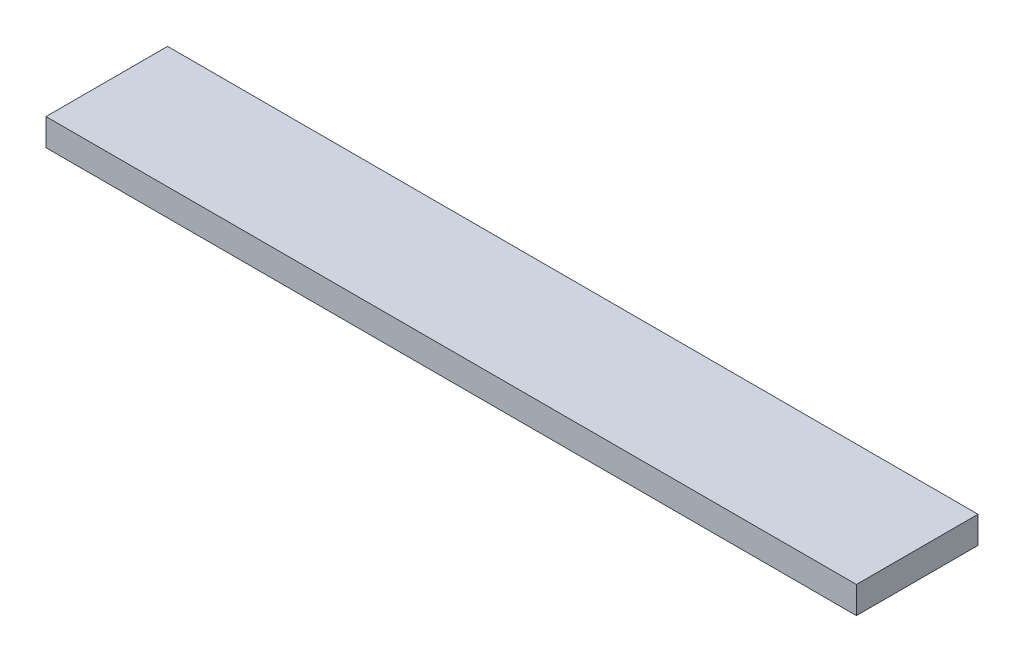
ISO-10303-21;
HEADER;
FILE_DESCRIPTION(('STEP AP214'),'2;1');
FILE_NAME('part.step','',(''),(''),'','','');
FILE_SCHEMA(('AUTOMOTIVE_DESIGN { 1 0 10303 214 1 1 1 1 }'));
ENDSEC;
DATA;
#1=APPLICATION_CONTEXT('core data for automotive mechanical design processes');
#2=APPLICATION_PROTOCOL_DEFINITION('international standard','automotive_design',2000,#1);
#3=PRODUCT_CONTEXT('',#1,'mechanical');
#4=PRODUCT('Part','Part','',(#3));
#5=PRODUCT_RELATED_PRODUCT_CATEGORY('part','',(#4));
#6=PRODUCT_DEFINITION_FORMATION('','',#4);
#7=PRODUCT_DEFINITION_CONTEXT('part definition',#1,'design');
#8=PRODUCT_DEFINITION('design','',#6,#7);
#9=PRODUCT_DEFINITION_SHAPE('','',#8);
#10=(LENGTH_UNIT() NAMED_UNIT(*) SI_UNIT(.MILLI.,.METRE.));
#11=(NAMED_UNIT(*) PLANE_ANGLE_UNIT() SI_UNIT($,.RADIAN.));
#12=(NAMED_UNIT(*) SI_UNIT($,.STERADIAN.) SOLID_ANGLE_UNIT());
#13=UNCERTAINTY_MEASURE_WITH_UNIT(LENGTH_MEASURE(1.E-05),#10,'distance_accuracy_value','');
#14=(GEOMETRIC_REPRESENTATION_CONTEXT(3) GLOBAL_UNCERTAINTY_ASSIGNED_CONTEXT((#13)) GLOBAL_UNIT_ASSIGNED_CONTEXT((#10,
#11,#12)) REPRESENTATION_CONTEXT('',''));
#15=CARTESIAN_POINT('',(0.,0.,0.));
#16=DIRECTION('',(0.,0.,1.));
#17=DIRECTION('',(1.,0.,0.));
#18=AXIS2_PLACEMENT_3D('',#15,#16,#17);
#19=CARTESIAN_POINT('',(150.,10.,-22.5));
#20=DIRECTION('',(-1.,0.,0.));
#21=DIRECTION('',(0.,0.,1.));
#22=AXIS2_PLACEMENT_3D('',#19,#20,#21);
#23=PLANE('',#22);
#24=DIRECTION('',(0.,0.,-1.));
#25=VECTOR('',#24,1.);
#26=CARTESIAN_POINT('',(150.,0.,-22.5));
#27=LINE('',#26,#25);
#28=CARTESIAN_POINT('',(150.,0.,22.5));
#29=VERTEX_POINT('',#28);
#30=CARTESIAN_POINT('',(150.,0.,-22.5));
#31=VERTEX_POINT('',#30);
#32=EDGE_CURVE('E107',#29,#31,#27,.T.);
#33=ORIENTED_EDGE('',*,*,#32,.T.);
#34=DIRECTION('',(0.,-1.,0.));
#35=VECTOR('',#34,1.);
#36=CARTESIAN_POINT('',(150.,10.,-22.5));
#37=LINE('',#36,#35);
#38=CARTESIAN_POINT('',(150.,10.,-22.5));
#39=VERTEX_POINT('',#38);
#40=EDGE_CURVE('E11',#39,#31,#37,.T.);
#41=ORIENTED_EDGE('',*,*,#40,.F.);
#42=DIRECTION('',(0.,0.,-1.));
#43=VECTOR('',#42,1.);
#44=CARTESIAN_POINT('',(150.,10.,-22.5));
#45=LINE('',#44,#43);
#46=CARTESIAN_POINT('',(150.,10.,22.5));
#47=VERTEX_POINT('',#46);
#48=EDGE_CURVE('E91',#47,#39,#45,.T.);
#49=ORIENTED_EDGE('',*,*,#48,.F.);
#50=DIRECTION('',(0.,-1.,0.));
#51=VECTOR('',#50,1.);
#52=CARTESIAN_POINT('',(150.,10.,22.5));
#53=LINE('',#52,#51);
#54=EDGE_CURVE('E103',#47,#29,#53,.T.);
#55=ORIENTED_EDGE('',*,*,#54,.T.);
#56=EDGE_LOOP('',(#33,#41,#49,#55));
#57=FACE_BOUND('',#56,.T.);
#58=ADVANCED_FACE('F39',(#57),#23,.F.);
#59=CARTESIAN_POINT('',(-150.,10.,-22.5));
#60=DIRECTION('',(0.,0.,1.));
#61=DIRECTION('',(1.,0.,0.));
#62=AXIS2_PLACEMENT_3D('',#59,#60,#61);
#63=PLANE('',#62);
#64=DIRECTION('',(-1.,0.,0.));
#65=VECTOR('',#64,1.);
#66=CARTESIAN_POINT('',(-150.,0.,-22.5));
#67=LINE('',#66,#65);
#68=CARTESIAN_POINT('',(-150.,0.,-22.5));
#69=VERTEX_POINT('',#68);
#70=EDGE_CURVE('E96',#31,#69,#67,.T.);
#71=ORIENTED_EDGE('',*,*,#70,.T.);
#72=DIRECTION('',(0.,-1.,0.));
#73=VECTOR('',#72,1.);
#74=CARTESIAN_POINT('',(-150.,10.,-22.5));
#75=LINE('',#74,#73);
#76=CARTESIAN_POINT('',(-150.,10.,-22.5));
#77=VERTEX_POINT('',#76);
#78=EDGE_CURVE('E48',#77,#69,#75,.T.);
#79=ORIENTED_EDGE('',*,*,#78,.F.);
#80=DIRECTION('',(-1.,0.,0.));
#81=VECTOR('',#80,1.);
#82=CARTESIAN_POINT('',(-150.,10.,-22.5));
#83=LINE('',#82,#81);
#84=EDGE_CURVE('E86',#39,#77,#83,.T.);
#85=ORIENTED_EDGE('',*,*,#84,.F.);
#86=ORIENTED_EDGE('',*,*,#40,.T.);
#87=EDGE_LOOP('',(#71,#79,#85,#86));
#88=FACE_BOUND('',#87,.T.);
#89=ADVANCED_FACE('F95',(#88),#63,.F.);
#90=CARTESIAN_POINT('',(-150.,10.,-22.5));
#91=DIRECTION('',(1.,0.,0.));
#92=DIRECTION('',(0.,0.,-1.));
#93=AXIS2_PLACEMENT_3D('',#90,#91,#92);
#94=PLANE('',#93);
#95=DIRECTION('',(0.,0.,1.));
#96=VECTOR('',#95,1.);
#97=CARTESIAN_POINT('',(-150.,0.,-22.5));
#98=LINE('',#97,#96);
#99=CARTESIAN_POINT('',(-150.,0.,22.5));
#100=VERTEX_POINT('',#99);
#101=EDGE_CURVE('E73',#69,#100,#98,.T.);
#102=ORIENTED_EDGE('',*,*,#101,.T.);
#103=DIRECTION('',(0.,-1.,0.));
#104=VECTOR('',#103,1.);
#105=CARTESIAN_POINT('',(-150.,10.,22.5));
#106=LINE('',#105,#104);
#107=CARTESIAN_POINT('',(-150.,10.,22.5));
#108=VERTEX_POINT('',#107);
#109=EDGE_CURVE('E98',#108,#100,#106,.T.);
#110=ORIENTED_EDGE('',*,*,#109,.F.);
#111=DIRECTION('',(0.,0.,1.));
#112=VECTOR('',#111,1.);
#113=CARTESIAN_POINT('',(-150.,10.,-22.5));
#114=LINE('',#113,#112);
#115=EDGE_CURVE('E89',#77,#108,#114,.T.);
#116=ORIENTED_EDGE('',*,*,#115,.F.);
#117=ORIENTED_EDGE('',*,*,#78,.T.);
#118=EDGE_LOOP('',(#102,#110,#116,#117));
#119=FACE_BOUND('',#118,.T.);
#120=ADVANCED_FACE('F99',(#119),#94,.F.);
#121=CARTESIAN_POINT('',(-150.,10.,22.5));
#122=DIRECTION('',(0.,0.,-1.));
#123=DIRECTION('',(-1.,0.,0.));
#124=AXIS2_PLACEMENT_3D('',#121,#122,#123);
#125=PLANE('',#124);
#126=DIRECTION('',(1.,0.,0.));
#127=VECTOR('',#126,1.);
#128=CARTESIAN_POINT('',(-150.,0.,22.5));
#129=LINE('',#128,#127);
#130=EDGE_CURVE('E79',#100,#29,#129,.T.);
#131=ORIENTED_EDGE('',*,*,#130,.T.);
#132=ORIENTED_EDGE('',*,*,#54,.F.);
#133=DIRECTION('',(1.,0.,0.));
#134=VECTOR('',#133,1.);
#135=CARTESIAN_POINT('',(-150.,10.,22.5));
#136=LINE('',#135,#134);
#137=EDGE_CURVE('E56',#108,#47,#136,.T.);
#138=ORIENTED_EDGE('',*,*,#137,.F.);
#139=ORIENTED_EDGE('',*,*,#109,.T.);
#140=EDGE_LOOP('',(#131,#132,#138,#139));
#141=FACE_BOUND('',#140,.T.);
#142=ADVANCED_FACE('F120',(#141),#125,.F.);
#143=CARTESIAN_POINT('',(0.,10.,0.));
#144=DIRECTION('',(0.,1.,0.));
#145=DIRECTION('',(0.,0.,1.));
#146=AXIS2_PLACEMENT_3D('',#143,#144,#145);
#147=PLANE('',#146);
#148=ORIENTED_EDGE('',*,*,#48,.T.);
#149=ORIENTED_EDGE('',*,*,#84,.T.);
#150=ORIENTED_EDGE('',*,*,#115,.T.);
#151=ORIENTED_EDGE('',*,*,#137,.T.);
#152=EDGE_LOOP('',(#148,#149,#150,#151));
#153=FACE_BOUND('',#152,.T.);
#154=ADVANCED_FACE('F87',(#153),#147,.T.);
#155=CARTESIAN_POINT('',(0.,0.,0.));
#156=DIRECTION('',(0.,1.,0.));
#157=DIRECTION('',(0.,0.,1.));
#158=AXIS2_PLACEMENT_3D('',#155,#156,#157);
#159=PLANE('',#158);
#160=ORIENTED_EDGE('',*,*,#32,.F.);
#161=ORIENTED_EDGE('',*,*,#130,.F.);
#162=ORIENTED_EDGE('',*,*,#101,.F.);
#163=ORIENTED_EDGE('',*,*,#70,.F.);
#164=EDGE_LOOP('',(#160,#161,#162,#163));
#165=FACE_BOUND('',#164,.T.);
#166=ADVANCED_FACE('F123',(#165),#159,.F.);
#167=CLOSED_SHELL('',(#58,#89,#120,#142,#154,#166));
#168=MANIFOLD_SOLID_BREP('B2',#167);
#169=ADVANCED_BREP_SHAPE_REPRESENTATION('',(#18,#168),#14);
#170=SHAPE_DEFINITION_REPRESENTATION(#9,#169);
ENDSEC;
END-ISO-10303-21;
